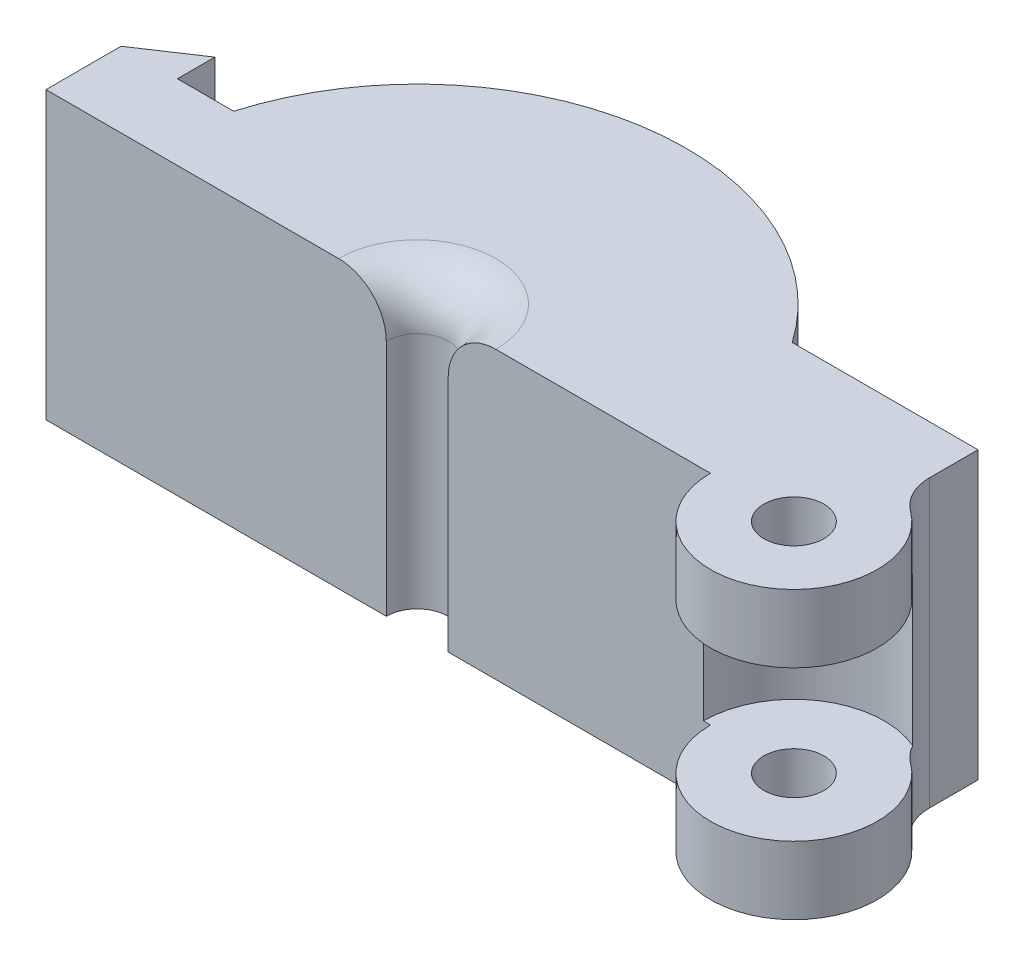
ISO-10303-21;
HEADER;
FILE_DESCRIPTION(('STEP AP214'),'2;1');
FILE_NAME('part.step','',(''),(''),'','','');
FILE_SCHEMA(('AUTOMOTIVE_DESIGN { 1 0 10303 214 1 1 1 1 }'));
ENDSEC;
DATA;
#1=APPLICATION_CONTEXT('core data for automotive mechanical design processes');
#2=APPLICATION_PROTOCOL_DEFINITION('international standard','automotive_design',2000,#1);
#3=PRODUCT_CONTEXT('',#1,'mechanical');
#4=PRODUCT('Part','Part','',(#3));
#5=PRODUCT_RELATED_PRODUCT_CATEGORY('part','',(#4));
#6=PRODUCT_DEFINITION_FORMATION('','',#4);
#7=PRODUCT_DEFINITION_CONTEXT('part definition',#1,'design');
#8=PRODUCT_DEFINITION('design','',#6,#7);
#9=PRODUCT_DEFINITION_SHAPE('','',#8);
#10=(LENGTH_UNIT() NAMED_UNIT(*) SI_UNIT(.MILLI.,.METRE.));
#11=(NAMED_UNIT(*) PLANE_ANGLE_UNIT() SI_UNIT($,.RADIAN.));
#12=(NAMED_UNIT(*) SI_UNIT($,.STERADIAN.) SOLID_ANGLE_UNIT());
#13=UNCERTAINTY_MEASURE_WITH_UNIT(LENGTH_MEASURE(1.E-05),#10,'distance_accuracy_value','');
#14=(GEOMETRIC_REPRESENTATION_CONTEXT(3) GLOBAL_UNCERTAINTY_ASSIGNED_CONTEXT((#13)) GLOBAL_UNIT_ASSIGNED_CONTEXT((#10,
#11,#12)) REPRESENTATION_CONTEXT('',''));
#15=CARTESIAN_POINT('',(0.,0.,0.));
#16=DIRECTION('',(0.,0.,1.));
#17=DIRECTION('',(1.,0.,0.));
#18=AXIS2_PLACEMENT_3D('',#15,#16,#17);
#19=CARTESIAN_POINT('',(0.,15.24,0.));
#20=DIRECTION('',(0.,0.,1.));
#21=DIRECTION('',(1.,0.,0.));
#22=AXIS2_PLACEMENT_3D('',#19,#20,#21);
#23=PLANE('',#22);
#24=DIRECTION('',(-1.,0.,0.));
#25=VECTOR('',#24,1.);
#26=CARTESIAN_POINT('',(0.,15.24,0.));
#27=LINE('',#26,#25);
#28=CARTESIAN_POINT('',(15.625,15.24,0.));
#29=VERTEX_POINT('',#28);
#30=CARTESIAN_POINT('',(4.191,15.24,0.));
#31=VERTEX_POINT('',#30);
#32=EDGE_CURVE('E208',#29,#31,#27,.T.);
#33=ORIENTED_EDGE('',*,*,#32,.T.);
#34=CARTESIAN_POINT('',(4.191,12.7,0.));
#35=DIRECTION('',(0.,0.,1.));
#36=DIRECTION('',(1.,0.,0.));
#37=AXIS2_PLACEMENT_3D('',#34,#35,#36);
#38=CIRCLE('',#37,2.54);
#39=CARTESIAN_POINT('',(1.651,12.7,0.));
#40=VERTEX_POINT('',#39);
#41=EDGE_CURVE('E284',#31,#40,#38,.T.);
#42=ORIENTED_EDGE('',*,*,#41,.T.);
#43=DIRECTION('',(0.,-1.,0.));
#44=VECTOR('',#43,1.);
#45=CARTESIAN_POINT('',(1.651,15.24,0.));
#46=LINE('',#45,#44);
#47=CARTESIAN_POINT('',(1.651,0.,0.));
#48=VERTEX_POINT('',#47);
#49=EDGE_CURVE('E257',#40,#48,#46,.T.);
#50=ORIENTED_EDGE('',*,*,#49,.T.);
#51=DIRECTION('',(-1.,0.,0.));
#52=VECTOR('',#51,1.);
#53=CARTESIAN_POINT('',(0.,0.,0.));
#54=LINE('',#53,#52);
#55=CARTESIAN_POINT('',(15.625,0.,0.));
#56=VERTEX_POINT('',#55);
#57=EDGE_CURVE('E240',#56,#48,#54,.T.);
#58=ORIENTED_EDGE('',*,*,#57,.F.);
#59=DIRECTION('',(0.,-1.,0.));
#60=VECTOR('',#59,1.);
#61=CARTESIAN_POINT('',(15.625,15.24,0.));
#62=LINE('',#61,#60);
#63=CARTESIAN_POINT('',(15.625,3.6195,0.));
#64=VERTEX_POINT('',#63);
#65=EDGE_CURVE('E254',#64,#56,#62,.T.);
#66=ORIENTED_EDGE('',*,*,#65,.F.);
#67=DIRECTION('',(-1.,0.,0.));
#68=VECTOR('',#67,1.);
#69=CARTESIAN_POINT('',(0.,3.6195,0.));
#70=LINE('',#69,#68);
#71=CARTESIAN_POINT('',(15.244,3.6195,0.));
#72=VERTEX_POINT('',#71);
#73=EDGE_CURVE('E178',#64,#72,#70,.T.);
#74=ORIENTED_EDGE('',*,*,#73,.T.);
#75=DIRECTION('',(0.,1.,0.));
#76=VECTOR('',#75,1.);
#77=CARTESIAN_POINT('',(15.244,3.6195,0.));
#78=LINE('',#77,#76);
#79=CARTESIAN_POINT('',(15.244,11.6205,0.));
#80=VERTEX_POINT('',#79);
#81=EDGE_CURVE('E170',#80,#72,#78,.F.);
#82=ORIENTED_EDGE('',*,*,#81,.F.);
#83=DIRECTION('',(-1.,0.,0.));
#84=VECTOR('',#83,1.);
#85=CARTESIAN_POINT('',(0.,11.6205,0.));
#86=LINE('',#85,#84);
#87=CARTESIAN_POINT('',(15.625,11.6205,0.));
#88=VERTEX_POINT('',#87);
#89=EDGE_CURVE('E159',#88,#80,#86,.T.);
#90=ORIENTED_EDGE('',*,*,#89,.F.);
#91=EDGE_CURVE('E255',#29,#88,#62,.T.);
#92=ORIENTED_EDGE('',*,*,#91,.F.);
#93=EDGE_LOOP('',(#33,#42,#50,#58,#66,#74,#82,#90,#92));
#94=FACE_BOUND('',#93,.T.);
#95=ADVANCED_FACE('F43',(#94),#23,.T.);
#96=CARTESIAN_POINT('',(20.07,15.24,0.));
#97=DIRECTION('',(0.,-1.,0.));
#98=DIRECTION('',(0.,0.,-1.));
#99=AXIS2_PLACEMENT_3D('',#96,#97,#98);
#100=CYLINDRICAL_SURFACE('',#99,4.445);
#101=CARTESIAN_POINT('',(20.07,0.,0.));
#102=DIRECTION('',(0.,1.,0.));
#103=DIRECTION('',(0.,0.,1.));
#104=AXIS2_PLACEMENT_3D('',#101,#102,#103);
#105=CIRCLE('',#104,4.445);
#106=CARTESIAN_POINT('',(22.7045454545455,0.,-3.58011106642432));
#107=VERTEX_POINT('',#106);
#108=EDGE_CURVE('E243',#56,#107,#105,.T.);
#109=ORIENTED_EDGE('',*,*,#108,.T.);
#110=DIRECTION('',(0.,-1.,0.));
#111=VECTOR('',#110,1.);
#112=CARTESIAN_POINT('',(22.7045454545455,15.24,-3.58011106642432));
#113=LINE('',#112,#111);
#114=CARTESIAN_POINT('',(22.7045454545455,3.6195,-3.58011106642432));
#115=VERTEX_POINT('',#114);
#116=EDGE_CURVE('E289',#107,#115,#113,.F.);
#117=ORIENTED_EDGE('',*,*,#116,.T.);
#118=CARTESIAN_POINT('',(20.07,3.6195,0.));
#119=DIRECTION('',(0.,1.,0.));
#120=DIRECTION('',(0.,0.,1.));
#121=AXIS2_PLACEMENT_3D('',#118,#119,#120);
#122=CIRCLE('',#121,4.445);
#123=EDGE_CURVE('E184',#64,#115,#122,.T.);
#124=ORIENTED_EDGE('',*,*,#123,.F.);
#125=ORIENTED_EDGE('',*,*,#65,.T.);
#126=EDGE_LOOP('',(#109,#117,#124,#125));
#127=FACE_BOUND('',#126,.T.);
#128=ADVANCED_FACE('F357',(#127),#100,.T.);
#129=CARTESIAN_POINT('',(21.67,15.24,0.));
#130=DIRECTION('',(1.,0.,0.));
#131=DIRECTION('',(0.,0.,-1.));
#132=AXIS2_PLACEMENT_3D('',#129,#130,#131);
#133=PLANE('',#132);
#134=DIRECTION('',(0.,0.,1.));
#135=VECTOR('',#134,1.);
#136=CARTESIAN_POINT('',(21.67,15.24,0.));
#137=LINE('',#136,#135);
#138=CARTESIAN_POINT('',(21.67,15.24,-8.2110501564365));
#139=VERTEX_POINT('',#138);
#140=CARTESIAN_POINT('',(21.67,15.24,-5.62588881866679));
#141=VERTEX_POINT('',#140);
#142=EDGE_CURVE('E213',#139,#141,#137,.T.);
#143=ORIENTED_EDGE('',*,*,#142,.T.);
#144=DIRECTION('',(0.,-1.,0.));
#145=VECTOR('',#144,1.);
#146=CARTESIAN_POINT('',(21.67,15.24,-5.62588881866679));
#147=LINE('',#146,#145);
#148=CARTESIAN_POINT('',(21.67,0.,-5.62588881866679));
#149=VERTEX_POINT('',#148);
#150=EDGE_CURVE('E286',#141,#149,#147,.T.);
#151=ORIENTED_EDGE('',*,*,#150,.T.);
#152=DIRECTION('',(0.,0.,1.));
#153=VECTOR('',#152,1.);
#154=CARTESIAN_POINT('',(21.67,0.,0.));
#155=LINE('',#154,#153);
#156=CARTESIAN_POINT('',(21.67,0.,-8.2110501564365));
#157=VERTEX_POINT('',#156);
#158=EDGE_CURVE('E246',#157,#149,#155,.T.);
#159=ORIENTED_EDGE('',*,*,#158,.F.);
#160=DIRECTION('',(0.,-1.,0.));
#161=VECTOR('',#160,1.);
#162=CARTESIAN_POINT('',(21.67,15.24,-8.2110501564365));
#163=LINE('',#162,#161);
#164=EDGE_CURVE('E252',#139,#157,#163,.T.);
#165=ORIENTED_EDGE('',*,*,#164,.F.);
#166=EDGE_LOOP('',(#143,#151,#159,#165));
#167=FACE_BOUND('',#166,.T.);
#168=ADVANCED_FACE('F313',(#167),#133,.T.);
#169=CARTESIAN_POINT('',(20.07,15.24,0.));
#170=DIRECTION('',(0.,-1.,0.));
#171=DIRECTION('',(0.,0.,-1.));
#172=AXIS2_PLACEMENT_3D('',#169,#170,#171);
#173=CYLINDRICAL_SURFACE('',#172,1.6);
#174=CARTESIAN_POINT('',(20.07,0.,0.));
#175=DIRECTION('',(0.,1.,0.));
#176=DIRECTION('',(0.,0.,1.));
#177=AXIS2_PLACEMENT_3D('',#174,#175,#176);
#178=CIRCLE('',#177,1.6);
#179=CARTESIAN_POINT('',(20.07,0.,-1.6));
#180=VERTEX_POINT('',#179);
#181=EDGE_CURVE('E179',#180,#180,#178,.T.);
#182=CARTESIAN_POINT('',(20.07,3.6195,0.));
#183=DIRECTION('',(0.,1.,0.));
#184=DIRECTION('',(0.,0.,1.));
#185=AXIS2_PLACEMENT_3D('',#182,#183,#184);
#186=CIRCLE('',#185,1.6);
#187=CARTESIAN_POINT('',(20.07,3.6195,-1.6));
#188=VERTEX_POINT('',#187);
#189=EDGE_CURVE('E167',#188,#188,#186,.T.);
#190=CARTESIAN_POINT('',(20.07,0.,-1.6));
#191=CARTESIAN_POINT('',(20.07,0.037703125,-1.6));
#192=CARTESIAN_POINT('',(20.07,0.07540625,-1.6));
#193=CARTESIAN_POINT('',(20.07,0.1508125,-1.6));
#194=CARTESIAN_POINT('',(20.07,0.188515625,-1.6));
#195=CARTESIAN_POINT('',(20.07,0.263921875,-1.6));
#196=CARTESIAN_POINT('',(20.07,0.301625,-1.6));
#197=CARTESIAN_POINT('',(20.07,0.37703125,-1.6));
#198=CARTESIAN_POINT('',(20.07,0.414734375,-1.6));
#199=CARTESIAN_POINT('',(20.07,0.490140625,-1.6));
#200=CARTESIAN_POINT('',(20.07,0.52784375,-1.6));
#201=CARTESIAN_POINT('',(20.07,0.60325,-1.6));
#202=CARTESIAN_POINT('',(20.07,0.640953125,-1.6));
#203=CARTESIAN_POINT('',(20.07,0.716359375,-1.6));
#204=CARTESIAN_POINT('',(20.07,0.7540625,-1.6));
#205=CARTESIAN_POINT('',(20.07,0.82946875,-1.6));
#206=CARTESIAN_POINT('',(20.07,0.867171874999999,-1.6));
#207=CARTESIAN_POINT('',(20.07,0.942578124999999,-1.6));
#208=CARTESIAN_POINT('',(20.07,0.980281249999999,-1.6));
#209=CARTESIAN_POINT('',(20.07,1.0556875,-1.6));
#210=CARTESIAN_POINT('',(20.07,1.093390625,-1.6));
#211=CARTESIAN_POINT('',(20.07,1.168796875,-1.6));
#212=CARTESIAN_POINT('',(20.07,1.2065,-1.6));
#213=CARTESIAN_POINT('',(20.07,1.28190625,-1.6));
#214=CARTESIAN_POINT('',(20.07,1.319609375,-1.6));
#215=CARTESIAN_POINT('',(20.07,1.395015625,-1.6));
#216=CARTESIAN_POINT('',(20.07,1.43271875,-1.6));
#217=CARTESIAN_POINT('',(20.07,1.508125,-1.6));
#218=CARTESIAN_POINT('',(20.07,1.545828125,-1.6));
#219=CARTESIAN_POINT('',(20.07,1.621234375,-1.6));
#220=CARTESIAN_POINT('',(20.07,1.6589375,-1.6));
#221=CARTESIAN_POINT('',(20.07,1.73434375,-1.6));
#222=CARTESIAN_POINT('',(20.07,1.772046875,-1.6));
#223=CARTESIAN_POINT('',(20.07,1.847453125,-1.6));
#224=CARTESIAN_POINT('',(20.07,1.88515625,-1.6));
#225=CARTESIAN_POINT('',(20.07,1.9605625,-1.6));
#226=CARTESIAN_POINT('',(20.07,1.998265625,-1.6));
#227=CARTESIAN_POINT('',(20.07,2.073671875,-1.6));
#228=CARTESIAN_POINT('',(20.07,2.111375,-1.6));
#229=CARTESIAN_POINT('',(20.07,2.18678125,-1.6));
#230=CARTESIAN_POINT('',(20.07,2.224484375,-1.6));
#231=CARTESIAN_POINT('',(20.07,2.299890625,-1.6));
#232=CARTESIAN_POINT('',(20.07,2.33759375,-1.6));
#233=CARTESIAN_POINT('',(20.07,2.413,-1.6));
#234=CARTESIAN_POINT('',(20.07,2.450703125,-1.6));
#235=CARTESIAN_POINT('',(20.07,2.526109375,-1.6));
#236=CARTESIAN_POINT('',(20.07,2.5638125,-1.6));
#237=CARTESIAN_POINT('',(20.07,2.63921875,-1.6));
#238=CARTESIAN_POINT('',(20.07,2.676921875,-1.6));
#239=CARTESIAN_POINT('',(20.07,2.752328125,-1.6));
#240=CARTESIAN_POINT('',(20.07,2.79003125,-1.6));
#241=CARTESIAN_POINT('',(20.07,2.8654375,-1.6));
#242=CARTESIAN_POINT('',(20.07,2.903140625,-1.6));
#243=CARTESIAN_POINT('',(20.07,2.978546875,-1.6));
#244=CARTESIAN_POINT('',(20.07,3.01625,-1.6));
#245=CARTESIAN_POINT('',(20.07,3.09165625,-1.6));
#246=CARTESIAN_POINT('',(20.07,3.129359375,-1.6));
#247=CARTESIAN_POINT('',(20.07,3.204765625,-1.6));
#248=CARTESIAN_POINT('',(20.07,3.24246875,-1.6));
#249=CARTESIAN_POINT('',(20.07,3.317875,-1.6));
#250=CARTESIAN_POINT('',(20.07,3.355578125,-1.6));
#251=CARTESIAN_POINT('',(20.07,3.430984375,-1.6));
#252=CARTESIAN_POINT('',(20.07,3.4686875,-1.6));
#253=CARTESIAN_POINT('',(20.07,3.54409375,-1.6));
#254=CARTESIAN_POINT('',(20.07,3.581796875,-1.6));
#255=CARTESIAN_POINT('',(20.07,3.6195,-1.6));
#256=B_SPLINE_CURVE_WITH_KNOTS('',3,(#190,#191,#192,#193,#194,#195,#196,#197,#198,#199,#200,
#201,#202,#203,#204,#205,#206,#207,#208,#209,#210,#211,#212,#213,#214,#215,#216,#217,#218,#219,
#220,#221,#222,#223,#224,#225,#226,#227,#228,#229,#230,#231,#232,#233,#234,#235,#236,#237,#238,
#239,#240,#241,#242,#243,#244,#245,#246,#247,#248,#249,#250,#251,#252,#253,#254,#255),
.UNSPECIFIED.,.F.,.F.,(4,2,2,2,2,2,2,2,2,2,2,2,2,2,2,2,2,2,2,2,2,2,2,2,2,2,2,2,2,2,2,2,4),(0.,
0.113109375,0.22621875,0.339328125,0.4524375,0.565546875,0.67865625,0.791765624999999,
0.904874999999999,1.017984375,1.13109375,1.244203125,1.3573125,1.470421875,1.58353125,
1.696640625,1.80975,1.922859375,2.03596875,2.149078125,2.2621875,2.375296875,2.48840625,
2.601515625,2.714625,2.827734375,2.94084375,3.053953125,3.1670625,3.280171875,3.39328125,
3.506390625,3.6195),.UNSPECIFIED.);
#257=EDGE_CURVE('BSEAM384',#180,#188,#256,.T.);
#258=ORIENTED_EDGE('',*,*,#181,.F.);
#259=ORIENTED_EDGE('',*,*,#189,.T.);
#260=ORIENTED_EDGE('',*,*,#257,.T.);
#261=ORIENTED_EDGE('',*,*,#257,.F.);
#262=EDGE_LOOP('',(#258,#260,#259,#261));
#263=FACE_BOUND('',#262,.T.);
#264=ADVANCED_FACE('F384',(#263),#173,.F.);
#265=CARTESIAN_POINT('',(0.,15.24,0.));
#266=DIRECTION('',(0.,-1.,0.));
#267=DIRECTION('',(0.,0.,-1.));
#268=AXIS2_PLACEMENT_3D('',#265,#266,#267);
#269=CYLINDRICAL_SURFACE('',#268,14.351);
#270=CARTESIAN_POINT('',(0.,0.,0.));
#271=DIRECTION('',(0.,1.,0.));
#272=DIRECTION('',(0.,0.,1.));
#273=AXIS2_PLACEMENT_3D('',#270,#271,#272);
#274=CIRCLE('',#273,14.351);
#275=CARTESIAN_POINT('',(11.7698707014344,0.,-8.2110501564365));
#276=VERTEX_POINT('',#275);
#277=CARTESIAN_POINT('',(-13.7822785126408,0.,-4.));
#278=VERTEX_POINT('',#277);
#279=EDGE_CURVE('E182',#276,#278,#274,.T.);
#280=ORIENTED_EDGE('',*,*,#279,.T.);
#281=DIRECTION('',(0.,-1.,0.));
#282=VECTOR('',#281,1.);
#283=CARTESIAN_POINT('',(-13.7822785126408,15.24,-4.));
#284=LINE('',#283,#282);
#285=CARTESIAN_POINT('',(-13.7822785126408,15.24,-4.));
#286=VERTEX_POINT('',#285);
#287=EDGE_CURVE('E269',#286,#278,#284,.T.);
#288=ORIENTED_EDGE('',*,*,#287,.F.);
#289=CARTESIAN_POINT('',(0.,15.24,0.));
#290=DIRECTION('',(0.,1.,0.));
#291=DIRECTION('',(0.,0.,1.));
#292=AXIS2_PLACEMENT_3D('',#289,#290,#291);
#293=CIRCLE('',#292,14.351);
#294=CARTESIAN_POINT('',(11.7698707014344,15.24,-8.2110501564365));
#295=VERTEX_POINT('',#294);
#296=EDGE_CURVE('E191',#295,#286,#293,.T.);
#297=ORIENTED_EDGE('',*,*,#296,.F.);
#298=DIRECTION('',(0.,-1.,0.));
#299=VECTOR('',#298,1.);
#300=CARTESIAN_POINT('',(11.7698707014344,15.24,-8.2110501564365));
#301=LINE('',#300,#299);
#302=EDGE_CURVE('E218',#295,#276,#301,.T.);
#303=ORIENTED_EDGE('',*,*,#302,.T.);
#304=EDGE_LOOP('',(#280,#288,#297,#303));
#305=FACE_BOUND('',#304,.T.);
#306=ADVANCED_FACE('F323',(#305),#269,.T.);
#307=CARTESIAN_POINT('',(0.,15.24,-4.));
#308=DIRECTION('',(0.,0.,1.));
#309=DIRECTION('',(1.,0.,0.));
#310=AXIS2_PLACEMENT_3D('',#307,#308,#309);
#311=PLANE('',#310);
#312=DIRECTION('',(-1.,0.,0.));
#313=VECTOR('',#312,1.);
#314=CARTESIAN_POINT('',(0.,0.,-4.));
#315=LINE('',#314,#313);
#316=CARTESIAN_POINT('',(-16.7822785126408,0.,-4.));
#317=VERTEX_POINT('',#316);
#318=EDGE_CURVE('E222',#278,#317,#315,.T.);
#319=ORIENTED_EDGE('',*,*,#318,.T.);
#320=DIRECTION('',(0.,-1.,0.));
#321=VECTOR('',#320,1.);
#322=CARTESIAN_POINT('',(-16.7822785126408,15.24,-4.));
#323=LINE('',#322,#321);
#324=CARTESIAN_POINT('',(-16.7822785126408,15.24,-4.));
#325=VERTEX_POINT('',#324);
#326=EDGE_CURVE('E267',#325,#317,#323,.T.);
#327=ORIENTED_EDGE('',*,*,#326,.F.);
#328=DIRECTION('',(-1.,0.,0.));
#329=VECTOR('',#328,1.);
#330=CARTESIAN_POINT('',(0.,15.24,-4.));
#331=LINE('',#330,#329);
#332=EDGE_CURVE('E195',#286,#325,#331,.T.);
#333=ORIENTED_EDGE('',*,*,#332,.F.);
#334=ORIENTED_EDGE('',*,*,#287,.T.);
#335=EDGE_LOOP('',(#319,#327,#333,#334));
#336=FACE_BOUND('',#335,.T.);
#337=ADVANCED_FACE('F326',(#336),#311,.F.);
#338=CARTESIAN_POINT('',(-16.7822785126408,15.24,0.));
#339=DIRECTION('',(1.,0.,0.));
#340=DIRECTION('',(0.,0.,-1.));
#341=AXIS2_PLACEMENT_3D('',#338,#339,#340);
#342=PLANE('',#341);
#343=DIRECTION('',(0.,0.,1.));
#344=VECTOR('',#343,1.);
#345=CARTESIAN_POINT('',(-16.7822785126408,0.,0.));
#346=LINE('',#345,#344);
#347=CARTESIAN_POINT('',(-16.7822785126408,0.,-6.));
#348=VERTEX_POINT('',#347);
#349=EDGE_CURVE('E225',#348,#317,#346,.T.);
#350=ORIENTED_EDGE('',*,*,#349,.F.);
#351=DIRECTION('',(0.,-1.,0.));
#352=VECTOR('',#351,1.);
#353=CARTESIAN_POINT('',(-16.7822785126408,15.24,-6.));
#354=LINE('',#353,#352);
#355=CARTESIAN_POINT('',(-16.7822785126408,15.24,-6.));
#356=VERTEX_POINT('',#355);
#357=EDGE_CURVE('E265',#356,#348,#354,.T.);
#358=ORIENTED_EDGE('',*,*,#357,.F.);
#359=DIRECTION('',(0.,0.,1.));
#360=VECTOR('',#359,1.);
#361=CARTESIAN_POINT('',(-16.7822785126408,15.24,0.));
#362=LINE('',#361,#360);
#363=EDGE_CURVE('E197',#356,#325,#362,.T.);
#364=ORIENTED_EDGE('',*,*,#363,.T.);
#365=ORIENTED_EDGE('',*,*,#326,.T.);
#366=EDGE_LOOP('',(#350,#358,#364,#365));
#367=FACE_BOUND('',#366,.T.);
#368=ADVANCED_FACE('F329',(#367),#342,.T.);
#369=CARTESIAN_POINT('',(-7.93300877312025,15.24,-11.8995131596804));
#370=DIRECTION('',(-0.554700196225229,0.,-0.832050294337843));
#371=DIRECTION('',(-0.832050294337844,0.,0.554700196225229));
#372=AXIS2_PLACEMENT_3D('',#369,#370,#371);
#373=PLANE('',#372);
#374=DIRECTION('',(0.832050294337844,0.,-0.554700196225229));
#375=VECTOR('',#374,1.);
#376=CARTESIAN_POINT('',(-7.93300877312025,0.,-11.8995131596804));
#377=LINE('',#376,#375);
#378=CARTESIAN_POINT('',(-19.7822785126408,0.,-4.));
#379=VERTEX_POINT('',#378);
#380=EDGE_CURVE('E228',#379,#348,#377,.T.);
#381=ORIENTED_EDGE('',*,*,#380,.F.);
#382=DIRECTION('',(0.,-1.,0.));
#383=VECTOR('',#382,1.);
#384=CARTESIAN_POINT('',(-19.7822785126408,15.24,-4.));
#385=LINE('',#384,#383);
#386=CARTESIAN_POINT('',(-19.7822785126408,15.24,-4.));
#387=VERTEX_POINT('',#386);
#388=EDGE_CURVE('E263',#387,#379,#385,.T.);
#389=ORIENTED_EDGE('',*,*,#388,.F.);
#390=DIRECTION('',(0.832050294337844,0.,-0.554700196225229));
#391=VECTOR('',#390,1.);
#392=CARTESIAN_POINT('',(-7.93300877312025,15.24,-11.8995131596804));
#393=LINE('',#392,#391);
#394=EDGE_CURVE('E200',#387,#356,#393,.T.);
#395=ORIENTED_EDGE('',*,*,#394,.T.);
#396=ORIENTED_EDGE('',*,*,#357,.T.);
#397=EDGE_LOOP('',(#381,#389,#395,#396));
#398=FACE_BOUND('',#397,.T.);
#399=ADVANCED_FACE('F334',(#398),#373,.T.);
#400=CARTESIAN_POINT('',(-19.7822785126408,15.24,0.));
#401=DIRECTION('',(-1.,0.,0.));
#402=DIRECTION('',(0.,0.,1.));
#403=AXIS2_PLACEMENT_3D('',#400,#401,#402);
#404=PLANE('',#403);
#405=DIRECTION('',(0.,0.,-1.));
#406=VECTOR('',#405,1.);
#407=CARTESIAN_POINT('',(-19.7822785126408,0.,0.));
#408=LINE('',#407,#406);
#409=CARTESIAN_POINT('',(-19.7822785126408,0.,0.));
#410=VERTEX_POINT('',#409);
#411=EDGE_CURVE('E231',#410,#379,#408,.T.);
#412=ORIENTED_EDGE('',*,*,#411,.F.);
#413=DIRECTION('',(0.,-1.,0.));
#414=VECTOR('',#413,1.);
#415=CARTESIAN_POINT('',(-19.7822785126408,15.24,0.));
#416=LINE('',#415,#414);
#417=CARTESIAN_POINT('',(-19.7822785126408,15.24,0.));
#418=VERTEX_POINT('',#417);
#419=EDGE_CURVE('E261',#418,#410,#416,.T.);
#420=ORIENTED_EDGE('',*,*,#419,.F.);
#421=DIRECTION('',(0.,0.,-1.));
#422=VECTOR('',#421,1.);
#423=CARTESIAN_POINT('',(-19.7822785126408,15.24,0.));
#424=LINE('',#423,#422);
#425=EDGE_CURVE('E203',#418,#387,#424,.T.);
#426=ORIENTED_EDGE('',*,*,#425,.T.);
#427=ORIENTED_EDGE('',*,*,#388,.T.);
#428=EDGE_LOOP('',(#412,#420,#426,#427));
#429=FACE_BOUND('',#428,.T.);
#430=ADVANCED_FACE('F337',(#429),#404,.T.);
#431=CARTESIAN_POINT('',(0.,15.24,0.));
#432=DIRECTION('',(0.,0.,1.));
#433=DIRECTION('',(1.,0.,0.));
#434=AXIS2_PLACEMENT_3D('',#431,#432,#433);
#435=PLANE('',#434);
#436=DIRECTION('',(0.,-1.,0.));
#437=VECTOR('',#436,1.);
#438=CARTESIAN_POINT('',(-1.651,15.24,0.));
#439=LINE('',#438,#437);
#440=CARTESIAN_POINT('',(-1.651,12.7,0.));
#441=VERTEX_POINT('',#440);
#442=CARTESIAN_POINT('',(-1.651,0.,0.));
#443=VERTEX_POINT('',#442);
#444=EDGE_CURVE('E259',#441,#443,#439,.T.);
#445=ORIENTED_EDGE('',*,*,#444,.F.);
#446=CARTESIAN_POINT('',(-4.191,12.7,0.));
#447=DIRECTION('',(0.,0.,1.));
#448=DIRECTION('',(1.,0.,0.));
#449=AXIS2_PLACEMENT_3D('',#446,#447,#448);
#450=CIRCLE('',#449,2.54);
#451=CARTESIAN_POINT('',(-4.191,15.24,0.));
#452=VERTEX_POINT('',#451);
#453=EDGE_CURVE('E280',#441,#452,#450,.T.);
#454=ORIENTED_EDGE('',*,*,#453,.T.);
#455=DIRECTION('',(-1.,0.,0.));
#456=VECTOR('',#455,1.);
#457=CARTESIAN_POINT('',(0.,15.24,0.));
#458=LINE('',#457,#456);
#459=EDGE_CURVE('E206',#452,#418,#458,.T.);
#460=ORIENTED_EDGE('',*,*,#459,.T.);
#461=ORIENTED_EDGE('',*,*,#419,.T.);
#462=DIRECTION('',(-1.,0.,0.));
#463=VECTOR('',#462,1.);
#464=CARTESIAN_POINT('',(0.,0.,0.));
#465=LINE('',#464,#463);
#466=EDGE_CURVE('E234',#443,#410,#465,.T.);
#467=ORIENTED_EDGE('',*,*,#466,.F.);
#468=EDGE_LOOP('',(#445,#454,#460,#461,#467));
#469=FACE_BOUND('',#468,.T.);
#470=ADVANCED_FACE('F363',(#469),#435,.T.);
#471=CARTESIAN_POINT('',(0.,15.24,0.));
#472=DIRECTION('',(0.,-1.,0.));
#473=DIRECTION('',(0.,0.,-1.));
#474=AXIS2_PLACEMENT_3D('',#471,#472,#473);
#475=CYLINDRICAL_SURFACE('',#474,1.651);
#476=ORIENTED_EDGE('',*,*,#49,.F.);
#477=CARTESIAN_POINT('',(0.,12.7,0.));
#478=DIRECTION('',(0.,1.,0.));
#479=DIRECTION('',(0.,0.,1.));
#480=AXIS2_PLACEMENT_3D('',#477,#478,#479);
#481=CIRCLE('',#480,1.651);
#482=EDGE_CURVE('E272',#40,#441,#481,.T.);
#483=ORIENTED_EDGE('',*,*,#482,.T.);
#484=ORIENTED_EDGE('',*,*,#444,.T.);
#485=CARTESIAN_POINT('',(0.,0.,0.));
#486=DIRECTION('',(0.,1.,0.));
#487=DIRECTION('',(0.,0.,1.));
#488=AXIS2_PLACEMENT_3D('',#485,#486,#487);
#489=CIRCLE('',#488,1.651);
#490=EDGE_CURVE('E237',#48,#443,#489,.T.);
#491=ORIENTED_EDGE('',*,*,#490,.F.);
#492=EDGE_LOOP('',(#476,#483,#484,#491));
#493=FACE_BOUND('',#492,.T.);
#494=ADVANCED_FACE('F349',(#493),#475,.F.);
#495=CARTESIAN_POINT('',(20.07,11.6205,0.));
#496=DIRECTION('',(0.,1.,0.));
#497=DIRECTION('',(0.,0.,1.));
#498=AXIS2_PLACEMENT_3D('',#495,#496,#497);
#499=CIRCLE('',#498,4.445);
#500=CARTESIAN_POINT('',(22.7045454545455,11.6205,-3.58011106642432));
#501=VERTEX_POINT('',#500);
#502=EDGE_CURVE('E163',#88,#501,#499,.T.);
#503=ORIENTED_EDGE('',*,*,#502,.T.);
#504=DIRECTION('',(0.,-1.,0.));
#505=VECTOR('',#504,1.);
#506=CARTESIAN_POINT('',(22.7045454545455,13.43025,-3.58011106642432));
#507=LINE('',#506,#505);
#508=CARTESIAN_POINT('',(22.7045454545455,15.24,-3.58011106642432));
#509=VERTEX_POINT('',#508);
#510=EDGE_CURVE('E291',#501,#509,#507,.F.);
#511=ORIENTED_EDGE('',*,*,#510,.T.);
#512=CARTESIAN_POINT('',(20.07,15.24,0.));
#513=DIRECTION('',(0.,1.,0.));
#514=DIRECTION('',(0.,0.,1.));
#515=AXIS2_PLACEMENT_3D('',#512,#513,#514);
#516=CIRCLE('',#515,4.445);
#517=EDGE_CURVE('E210',#29,#509,#516,.T.);
#518=ORIENTED_EDGE('',*,*,#517,.F.);
#519=ORIENTED_EDGE('',*,*,#91,.T.);
#520=EDGE_LOOP('',(#503,#511,#518,#519));
#521=FACE_BOUND('',#520,.T.);
#522=ADVANCED_FACE('F300',(#521),#100,.T.);
#523=CARTESIAN_POINT('',(20.07,11.6205,0.));
#524=DIRECTION('',(0.,1.,0.));
#525=DIRECTION('',(0.,0.,1.));
#526=AXIS2_PLACEMENT_3D('',#523,#524,#525);
#527=CIRCLE('',#526,1.6);
#528=CARTESIAN_POINT('',(20.07,11.6205,-1.6));
#529=VERTEX_POINT('',#528);
#530=EDGE_CURVE('E273',#529,#529,#527,.T.);
#531=CARTESIAN_POINT('',(20.07,15.24,0.));
#532=DIRECTION('',(0.,1.,0.));
#533=DIRECTION('',(0.,0.,1.));
#534=AXIS2_PLACEMENT_3D('',#531,#532,#533);
#535=CIRCLE('',#534,1.6);
#536=CARTESIAN_POINT('',(20.07,15.24,-1.6));
#537=VERTEX_POINT('',#536);
#538=EDGE_CURVE('E188',#537,#537,#535,.T.);
#539=CARTESIAN_POINT('',(20.07,11.6205,-1.6));
#540=CARTESIAN_POINT('',(20.07,11.658203125,-1.6));
#541=CARTESIAN_POINT('',(20.07,11.69590625,-1.6));
#542=CARTESIAN_POINT('',(20.07,11.7713125,-1.6));
#543=CARTESIAN_POINT('',(20.07,11.809015625,-1.6));
#544=CARTESIAN_POINT('',(20.07,11.884421875,-1.6));
#545=CARTESIAN_POINT('',(20.07,11.922125,-1.6));
#546=CARTESIAN_POINT('',(20.07,11.99753125,-1.6));
#547=CARTESIAN_POINT('',(20.07,12.035234375,-1.6));
#548=CARTESIAN_POINT('',(20.07,12.110640625,-1.6));
#549=CARTESIAN_POINT('',(20.07,12.14834375,-1.6));
#550=CARTESIAN_POINT('',(20.07,12.22375,-1.6));
#551=CARTESIAN_POINT('',(20.07,12.261453125,-1.6));
#552=CARTESIAN_POINT('',(20.07,12.336859375,-1.6));
#553=CARTESIAN_POINT('',(20.07,12.3745625,-1.6));
#554=CARTESIAN_POINT('',(20.07,12.44996875,-1.6));
#555=CARTESIAN_POINT('',(20.07,12.487671875,-1.6));
#556=CARTESIAN_POINT('',(20.07,12.563078125,-1.6));
#557=CARTESIAN_POINT('',(20.07,12.60078125,-1.6));
#558=CARTESIAN_POINT('',(20.07,12.6761875,-1.6));
#559=CARTESIAN_POINT('',(20.07,12.713890625,-1.6));
#560=CARTESIAN_POINT('',(20.07,12.789296875,-1.6));
#561=CARTESIAN_POINT('',(20.07,12.827,-1.6));
#562=CARTESIAN_POINT('',(20.07,12.90240625,-1.6));
#563=CARTESIAN_POINT('',(20.07,12.940109375,-1.6));
#564=CARTESIAN_POINT('',(20.07,13.015515625,-1.6));
#565=CARTESIAN_POINT('',(20.07,13.05321875,-1.6));
#566=CARTESIAN_POINT('',(20.07,13.128625,-1.6));
#567=CARTESIAN_POINT('',(20.07,13.166328125,-1.6));
#568=CARTESIAN_POINT('',(20.07,13.241734375,-1.6));
#569=CARTESIAN_POINT('',(20.07,13.2794375,-1.6));
#570=CARTESIAN_POINT('',(20.07,13.35484375,-1.6));
#571=CARTESIAN_POINT('',(20.07,13.392546875,-1.6));
#572=CARTESIAN_POINT('',(20.07,13.467953125,-1.6));
#573=CARTESIAN_POINT('',(20.07,13.50565625,-1.6));
#574=CARTESIAN_POINT('',(20.07,13.5810625,-1.6));
#575=CARTESIAN_POINT('',(20.07,13.618765625,-1.6));
#576=CARTESIAN_POINT('',(20.07,13.694171875,-1.6));
#577=CARTESIAN_POINT('',(20.07,13.731875,-1.6));
#578=CARTESIAN_POINT('',(20.07,13.80728125,-1.6));
#579=CARTESIAN_POINT('',(20.07,13.844984375,-1.6));
#580=CARTESIAN_POINT('',(20.07,13.920390625,-1.6));
#581=CARTESIAN_POINT('',(20.07,13.95809375,-1.6));
#582=CARTESIAN_POINT('',(20.07,14.0335,-1.6));
#583=CARTESIAN_POINT('',(20.07,14.071203125,-1.6));
#584=CARTESIAN_POINT('',(20.07,14.146609375,-1.6));
#585=CARTESIAN_POINT('',(20.07,14.1843125,-1.6));
#586=CARTESIAN_POINT('',(20.07,14.25971875,-1.6));
#587=CARTESIAN_POINT('',(20.07,14.297421875,-1.6));
#588=CARTESIAN_POINT('',(20.07,14.372828125,-1.6));
#589=CARTESIAN_POINT('',(20.07,14.41053125,-1.6));
#590=CARTESIAN_POINT('',(20.07,14.4859375,-1.6));
#591=CARTESIAN_POINT('',(20.07,14.523640625,-1.6));
#592=CARTESIAN_POINT('',(20.07,14.599046875,-1.6));
#593=CARTESIAN_POINT('',(20.07,14.63675,-1.6));
#594=CARTESIAN_POINT('',(20.07,14.71215625,-1.6));
#595=CARTESIAN_POINT('',(20.07,14.749859375,-1.6));
#596=CARTESIAN_POINT('',(20.07,14.825265625,-1.6));
#597=CARTESIAN_POINT('',(20.07,14.86296875,-1.6));
#598=CARTESIAN_POINT('',(20.07,14.938375,-1.6));
#599=CARTESIAN_POINT('',(20.07,14.976078125,-1.6));
#600=CARTESIAN_POINT('',(20.07,15.051484375,-1.6));
#601=CARTESIAN_POINT('',(20.07,15.0891875,-1.6));
#602=CARTESIAN_POINT('',(20.07,15.16459375,-1.6));
#603=CARTESIAN_POINT('',(20.07,15.202296875,-1.6));
#604=CARTESIAN_POINT('',(20.07,15.24,-1.6));
#605=B_SPLINE_CURVE_WITH_KNOTS('',3,(#539,#540,#541,#542,#543,#544,#545,#546,#547,#548,#549,
#550,#551,#552,#553,#554,#555,#556,#557,#558,#559,#560,#561,#562,#563,#564,#565,#566,#567,#568,
#569,#570,#571,#572,#573,#574,#575,#576,#577,#578,#579,#580,#581,#582,#583,#584,#585,#586,#587,
#588,#589,#590,#591,#592,#593,#594,#595,#596,#597,#598,#599,#600,#601,#602,#603,#604),
.UNSPECIFIED.,.F.,.F.,(4,2,2,2,2,2,2,2,2,2,2,2,2,2,2,2,2,2,2,2,2,2,2,2,2,2,2,2,2,2,2,2,4),(0.,
0.113109375,0.22621875,0.339328125,0.452437500000001,0.565546875000001,0.678656250000001,
0.791765625000001,0.904875000000001,1.017984375,1.13109375,1.244203125,1.3573125,1.470421875,
1.58353125,1.696640625,1.80975,1.922859375,2.03596875,2.149078125,2.2621875,2.375296875,
2.48840625,2.601515625,2.714625,2.827734375,2.94084375,3.053953125,3.1670625,3.280171875,
3.39328125,3.506390625,3.6195),.UNSPECIFIED.);
#606=EDGE_CURVE('BSEAM381',#529,#537,#605,.T.);
#607=ORIENTED_EDGE('',*,*,#530,.F.);
#608=ORIENTED_EDGE('',*,*,#538,.T.);
#609=ORIENTED_EDGE('',*,*,#606,.T.);
#610=ORIENTED_EDGE('',*,*,#606,.F.);
#611=EDGE_LOOP('',(#607,#609,#608,#610));
#612=FACE_BOUND('',#611,.T.);
#613=ADVANCED_FACE('F381',(#612),#173,.F.);
#614=CARTESIAN_POINT('',(0.,15.24,-8.2110501564365));
#615=DIRECTION('',(0.,0.,-1.));
#616=DIRECTION('',(-1.,0.,0.));
#617=AXIS2_PLACEMENT_3D('',#614,#615,#616);
#618=PLANE('',#617);
#619=DIRECTION('',(1.,0.,0.));
#620=VECTOR('',#619,1.);
#621=CARTESIAN_POINT('',(0.,0.,-8.2110501564365));
#622=LINE('',#621,#620);
#623=EDGE_CURVE('E192',#276,#157,#622,.T.);
#624=ORIENTED_EDGE('',*,*,#623,.F.);
#625=ORIENTED_EDGE('',*,*,#302,.F.);
#626=DIRECTION('',(1.,0.,0.));
#627=VECTOR('',#626,1.);
#628=CARTESIAN_POINT('',(0.,15.24,-8.2110501564365));
#629=LINE('',#628,#627);
#630=EDGE_CURVE('E216',#295,#139,#629,.T.);
#631=ORIENTED_EDGE('',*,*,#630,.T.);
#632=ORIENTED_EDGE('',*,*,#164,.T.);
#633=EDGE_LOOP('',(#624,#625,#631,#632));
#634=FACE_BOUND('',#633,.T.);
#635=ADVANCED_FACE('F317',(#634),#618,.T.);
#636=CARTESIAN_POINT('',(0.,15.24,0.));
#637=DIRECTION('',(0.,1.,0.));
#638=DIRECTION('',(0.,0.,1.));
#639=AXIS2_PLACEMENT_3D('',#636,#637,#638);
#640=PLANE('',#639);
#641=ORIENTED_EDGE('',*,*,#538,.F.);
#642=EDGE_LOOP('',(#641));
#643=FACE_BOUND('',#642,.T.);
#644=ORIENTED_EDGE('',*,*,#459,.F.);
#645=CARTESIAN_POINT('',(0.,15.24,0.));
#646=DIRECTION('',(0.,1.,0.));
#647=DIRECTION('',(0.,0.,1.));
#648=AXIS2_PLACEMENT_3D('',#645,#646,#647);
#649=CIRCLE('',#648,4.191);
#650=EDGE_CURVE('E282',#452,#31,#649,.F.);
#651=ORIENTED_EDGE('',*,*,#650,.T.);
#652=ORIENTED_EDGE('',*,*,#32,.F.);
#653=ORIENTED_EDGE('',*,*,#517,.T.);
#654=CARTESIAN_POINT('',(24.21,15.24,-5.62588881866679));
#655=DIRECTION('',(0.,1.,0.));
#656=DIRECTION('',(0.,0.,1.));
#657=AXIS2_PLACEMENT_3D('',#654,#655,#656);
#658=CIRCLE('',#657,2.54);
#659=EDGE_CURVE('E11',#509,#141,#658,.F.);
#660=ORIENTED_EDGE('',*,*,#659,.T.);
#661=ORIENTED_EDGE('',*,*,#142,.F.);
#662=ORIENTED_EDGE('',*,*,#630,.F.);
#663=ORIENTED_EDGE('',*,*,#296,.T.);
#664=ORIENTED_EDGE('',*,*,#332,.T.);
#665=ORIENTED_EDGE('',*,*,#363,.F.);
#666=ORIENTED_EDGE('',*,*,#394,.F.);
#667=ORIENTED_EDGE('',*,*,#425,.F.);
#668=EDGE_LOOP('',(#644,#651,#652,#653,#660,#661,#662,#663,#664,#665,#666,#667));
#669=FACE_BOUND('',#668,.T.);
#670=ADVANCED_FACE('F309',(#643,#669),#640,.T.);
#671=CARTESIAN_POINT('',(0.,0.,0.));
#672=DIRECTION('',(0.,1.,0.));
#673=DIRECTION('',(0.,0.,1.));
#674=AXIS2_PLACEMENT_3D('',#671,#672,#673);
#675=PLANE('',#674);
#676=ORIENTED_EDGE('',*,*,#181,.T.);
#677=EDGE_LOOP('',(#676));
#678=FACE_BOUND('',#677,.T.);
#679=ORIENTED_EDGE('',*,*,#279,.F.);
#680=ORIENTED_EDGE('',*,*,#623,.T.);
#681=ORIENTED_EDGE('',*,*,#158,.T.);
#682=CARTESIAN_POINT('',(24.21,0.,-5.62588881866679));
#683=DIRECTION('',(0.,1.,0.));
#684=DIRECTION('',(0.,0.,1.));
#685=AXIS2_PLACEMENT_3D('',#682,#683,#684);
#686=CIRCLE('',#685,2.54);
#687=EDGE_CURVE('E293',#149,#107,#686,.T.);
#688=ORIENTED_EDGE('',*,*,#687,.T.);
#689=ORIENTED_EDGE('',*,*,#108,.F.);
#690=ORIENTED_EDGE('',*,*,#57,.T.);
#691=ORIENTED_EDGE('',*,*,#490,.T.);
#692=ORIENTED_EDGE('',*,*,#466,.T.);
#693=ORIENTED_EDGE('',*,*,#411,.T.);
#694=ORIENTED_EDGE('',*,*,#380,.T.);
#695=ORIENTED_EDGE('',*,*,#349,.T.);
#696=ORIENTED_EDGE('',*,*,#318,.F.);
#697=EDGE_LOOP('',(#679,#680,#681,#688,#689,#690,#691,#692,#693,#694,#695,#696));
#698=FACE_BOUND('',#697,.T.);
#699=ADVANCED_FACE('F354',(#678,#698),#675,.F.);
#700=CARTESIAN_POINT('',(20.07,3.6195,0.));
#701=DIRECTION('',(0.,1.,0.));
#702=DIRECTION('',(0.,0.,1.));
#703=AXIS2_PLACEMENT_3D('',#700,#701,#702);
#704=CYLINDRICAL_SURFACE('',#703,4.826);
#705=ORIENTED_EDGE('',*,*,#81,.T.);
#706=CARTESIAN_POINT('',(20.07,3.6195,0.));
#707=DIRECTION('',(0.,1.,0.));
#708=DIRECTION('',(0.,0.,1.));
#709=AXIS2_PLACEMENT_3D('',#706,#707,#708);
#710=CIRCLE('',#709,4.826);
#711=CARTESIAN_POINT('',(21.9645953217228,3.6195,-4.43855658597547));
#712=VERTEX_POINT('',#711);
#713=EDGE_CURVE('E65',#712,#72,#710,.T.);
#714=ORIENTED_EDGE('',*,*,#713,.F.);
#715=DIRECTION('',(0.,-1.,0.));
#716=VECTOR('',#715,1.);
#717=CARTESIAN_POINT('',(21.9645953217233,3.6195,-4.43855658597674));
#718=LINE('',#717,#716);
#719=CARTESIAN_POINT('',(21.9645953217228,11.6205,-4.43855658597547));
#720=VERTEX_POINT('',#719);
#721=EDGE_CURVE('E172',#712,#720,#718,.F.);
#722=ORIENTED_EDGE('',*,*,#721,.T.);
#723=CARTESIAN_POINT('',(20.07,11.6205,0.));
#724=DIRECTION('',(0.,1.,0.));
#725=DIRECTION('',(0.,0.,1.));
#726=AXIS2_PLACEMENT_3D('',#723,#724,#725);
#727=CIRCLE('',#726,4.826);
#728=EDGE_CURVE('E58',#720,#80,#727,.T.);
#729=ORIENTED_EDGE('',*,*,#728,.T.);
#730=EDGE_LOOP('',(#705,#714,#722,#729));
#731=FACE_BOUND('',#730,.T.);
#732=ADVANCED_FACE('F169',(#731),#704,.F.);
#733=CARTESIAN_POINT('',(20.07,3.6195,0.));
#734=DIRECTION('',(0.,1.,0.));
#735=DIRECTION('',(0.,0.,1.));
#736=AXIS2_PLACEMENT_3D('',#733,#734,#735);
#737=PLANE('',#736);
#738=ORIENTED_EDGE('',*,*,#189,.F.);
#739=EDGE_LOOP('',(#738));
#740=FACE_BOUND('',#739,.T.);
#741=ORIENTED_EDGE('',*,*,#123,.T.);
#742=CARTESIAN_POINT('',(24.21,3.6195,-5.62588881866679));
#743=DIRECTION('',(0.,1.,0.));
#744=DIRECTION('',(0.,0.,1.));
#745=AXIS2_PLACEMENT_3D('',#742,#743,#744);
#746=CIRCLE('',#745,2.54);
#747=EDGE_CURVE('E295',#115,#712,#746,.F.);
#748=ORIENTED_EDGE('',*,*,#747,.T.);
#749=ORIENTED_EDGE('',*,*,#713,.T.);
#750=ORIENTED_EDGE('',*,*,#73,.F.);
#751=EDGE_LOOP('',(#741,#748,#749,#750));
#752=FACE_BOUND('',#751,.T.);
#753=ADVANCED_FACE('F362',(#740,#752),#737,.T.);
#754=CARTESIAN_POINT('',(20.07,11.6205,0.));
#755=DIRECTION('',(0.,1.,0.));
#756=DIRECTION('',(0.,0.,1.));
#757=AXIS2_PLACEMENT_3D('',#754,#755,#756);
#758=PLANE('',#757);
#759=ORIENTED_EDGE('',*,*,#89,.T.);
#760=ORIENTED_EDGE('',*,*,#728,.F.);
#761=CARTESIAN_POINT('',(24.21,11.6205,-5.62588881866679));
#762=DIRECTION('',(0.,1.,0.));
#763=DIRECTION('',(0.,0.,1.));
#764=AXIS2_PLACEMENT_3D('',#761,#762,#763);
#765=CIRCLE('',#764,2.54);
#766=EDGE_CURVE('E51',#720,#501,#765,.T.);
#767=ORIENTED_EDGE('',*,*,#766,.T.);
#768=ORIENTED_EDGE('',*,*,#502,.F.);
#769=EDGE_LOOP('',(#759,#760,#767,#768));
#770=FACE_BOUND('',#769,.T.);
#771=ORIENTED_EDGE('',*,*,#530,.T.);
#772=EDGE_LOOP('',(#771));
#773=FACE_BOUND('',#772,.T.);
#774=ADVANCED_FACE('F160',(#770,#773),#758,.F.);
#775=CARTESIAN_POINT('',(0.,12.7,0.));
#776=DIRECTION('',(0.,1.,0.));
#777=DIRECTION('',(0.,0.,1.));
#778=AXIS2_PLACEMENT_3D('',#775,#776,#777);
#779=TOROIDAL_SURFACE('',#778,4.191,2.54);
#780=ORIENTED_EDGE('',*,*,#41,.F.);
#781=ORIENTED_EDGE('',*,*,#650,.F.);
#782=ORIENTED_EDGE('',*,*,#453,.F.);
#783=ORIENTED_EDGE('',*,*,#482,.F.);
#784=EDGE_LOOP('',(#780,#781,#782,#783));
#785=FACE_BOUND('',#784,.T.);
#786=ADVANCED_FACE('F343',(#785),#779,.T.);
#787=CARTESIAN_POINT('',(24.21,15.24,-5.62588881866679));
#788=DIRECTION('',(0.,-1.,0.));
#789=DIRECTION('',(0.,0.,-1.));
#790=AXIS2_PLACEMENT_3D('',#787,#788,#789);
#791=CYLINDRICAL_SURFACE('',#790,2.54);
#792=ORIENTED_EDGE('',*,*,#747,.F.);
#793=ORIENTED_EDGE('',*,*,#116,.F.);
#794=ORIENTED_EDGE('',*,*,#687,.F.);
#795=ORIENTED_EDGE('',*,*,#150,.F.);
#796=ORIENTED_EDGE('',*,*,#659,.F.);
#797=ORIENTED_EDGE('',*,*,#510,.F.);
#798=ORIENTED_EDGE('',*,*,#766,.F.);
#799=ORIENTED_EDGE('',*,*,#721,.F.);
#800=EDGE_LOOP('',(#792,#793,#794,#795,#796,#797,#798,#799));
#801=FACE_BOUND('',#800,.T.);
#802=ADVANCED_FACE('F45',(#801),#791,.F.);
#803=CLOSED_SHELL('',(#95,#128,#168,#264,#306,#337,#368,#399,#430,#470,#494,#522,#613,#635,#670,
#699,#732,#753,#774,#786,#802));
#804=MANIFOLD_SOLID_BREP('B2',#803);
#805=ADVANCED_BREP_SHAPE_REPRESENTATION('',(#18,#804),#14);
#806=SHAPE_DEFINITION_REPRESENTATION(#9,#805);
ENDSEC;
END-ISO-10303-21;
